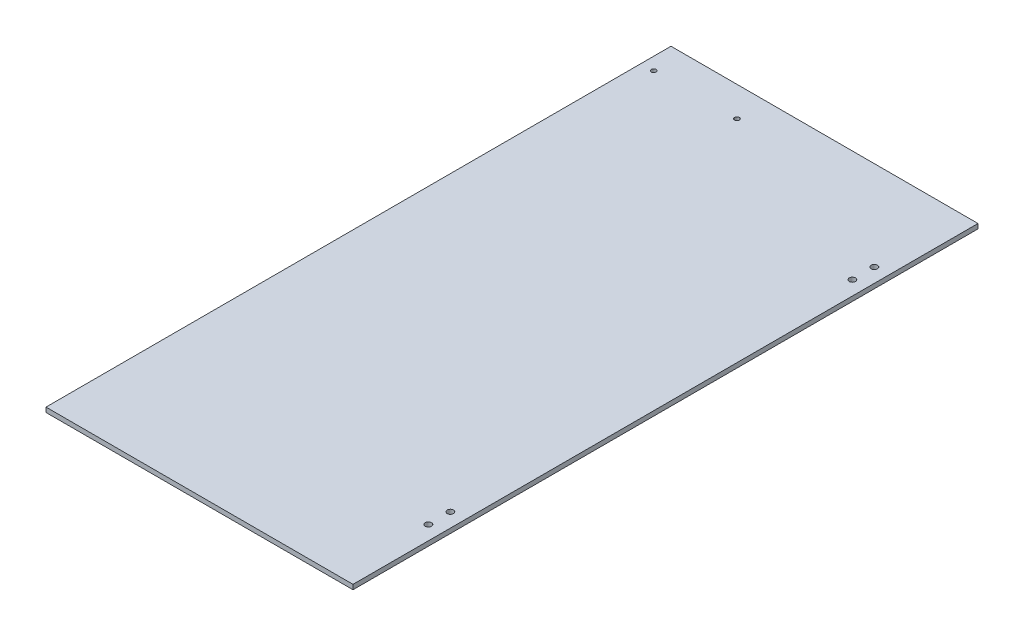
ISO-10303-21;
HEADER;
FILE_DESCRIPTION(('STEP AP214'),'2;1');
FILE_NAME('part.step','',(''),(''),'','','');
FILE_SCHEMA(('AUTOMOTIVE_DESIGN { 1 0 10303 214 1 1 1 1 }'));
ENDSEC;
DATA;
#1=APPLICATION_CONTEXT('core data for automotive mechanical design processes');
#2=APPLICATION_PROTOCOL_DEFINITION('international standard','automotive_design',2000,#1);
#3=PRODUCT_CONTEXT('',#1,'mechanical');
#4=PRODUCT('Part','Part','',(#3));
#5=PRODUCT_RELATED_PRODUCT_CATEGORY('part','',(#4));
#6=PRODUCT_DEFINITION_FORMATION('','',#4);
#7=PRODUCT_DEFINITION_CONTEXT('part definition',#1,'design');
#8=PRODUCT_DEFINITION('design','',#6,#7);
#9=PRODUCT_DEFINITION_SHAPE('','',#8);
#10=(LENGTH_UNIT() NAMED_UNIT(*) SI_UNIT(.MILLI.,.METRE.));
#11=(NAMED_UNIT(*) PLANE_ANGLE_UNIT() SI_UNIT($,.RADIAN.));
#12=(NAMED_UNIT(*) SI_UNIT($,.STERADIAN.) SOLID_ANGLE_UNIT());
#13=UNCERTAINTY_MEASURE_WITH_UNIT(LENGTH_MEASURE(1.E-05),#10,'distance_accuracy_value','');
#14=(GEOMETRIC_REPRESENTATION_CONTEXT(3) GLOBAL_UNCERTAINTY_ASSIGNED_CONTEXT((#13)) GLOBAL_UNIT_ASSIGNED_CONTEXT((#10,
#11,#12)) REPRESENTATION_CONTEXT('',''));
#15=CARTESIAN_POINT('',(0.,0.,0.));
#16=DIRECTION('',(0.,0.,1.));
#17=DIRECTION('',(1.,0.,0.));
#18=AXIS2_PLACEMENT_3D('',#15,#16,#17);
#19=CARTESIAN_POINT('',(0.,-193.798939869289,0.));
#20=DIRECTION('',(0.,1.,0.));
#21=DIRECTION('',(0.,0.,1.));
#22=AXIS2_PLACEMENT_3D('',#19,#20,#21);
#23=PLANE('',#22);
#24=CARTESIAN_POINT('',(99.7891563862978,-193.798939869289,731.620141884642));
#25=DIRECTION('',(0.,1.,0.));
#26=DIRECTION('',(0.,0.,1.));
#27=AXIS2_PLACEMENT_3D('',#24,#25,#26);
#28=CIRCLE('',#27,2.);
#29=CARTESIAN_POINT('',(99.7891563862978,-193.798939869289,733.620141884642));
#30=VERTEX_POINT('',#29);
#31=EDGE_CURVE('E113',#30,#30,#28,.T.);
#32=ORIENTED_EDGE('',*,*,#31,.F.);
#33=EDGE_LOOP('',(#32));
#34=FACE_BOUND('',#33,.T.);
#35=CARTESIAN_POINT('',(99.7891563862979,-193.798939869289,717.620141884642));
#36=DIRECTION('',(0.,1.,0.));
#37=DIRECTION('',(0.,0.,1.));
#38=AXIS2_PLACEMENT_3D('',#35,#36,#37);
#39=CIRCLE('',#38,2.);
#40=CARTESIAN_POINT('',(99.7891563862979,-193.798939869289,719.620141884642));
#41=VERTEX_POINT('',#40);
#42=EDGE_CURVE('E120',#41,#41,#39,.T.);
#43=ORIENTED_EDGE('',*,*,#42,.F.);
#44=EDGE_LOOP('',(#43));
#45=FACE_BOUND('',#44,.T.);
#46=CARTESIAN_POINT('',(99.7891563862979,-193.798939869289,461.620141884643));
#47=DIRECTION('',(0.,1.,0.));
#48=DIRECTION('',(0.,0.,1.));
#49=AXIS2_PLACEMENT_3D('',#46,#47,#48);
#50=CIRCLE('',#49,2.);
#51=CARTESIAN_POINT('',(99.7891563862979,-193.798939869289,463.620141884643));
#52=VERTEX_POINT('',#51);
#53=EDGE_CURVE('E124',#52,#52,#50,.T.);
#54=ORIENTED_EDGE('',*,*,#53,.F.);
#55=EDGE_LOOP('',(#54));
#56=FACE_BOUND('',#55,.T.);
#57=CARTESIAN_POINT('',(99.7891563862979,-193.798939869289,447.620141884643));
#58=DIRECTION('',(0.,1.,0.));
#59=DIRECTION('',(0.,0.,1.));
#60=AXIS2_PLACEMENT_3D('',#57,#58,#59);
#61=CIRCLE('',#60,2.);
#62=CARTESIAN_POINT('',(99.7891563862979,-193.798939869289,449.620141884643));
#63=VERTEX_POINT('',#62);
#64=EDGE_CURVE('E128',#63,#63,#61,.T.);
#65=ORIENTED_EDGE('',*,*,#64,.F.);
#66=EDGE_LOOP('',(#65));
#67=FACE_BOUND('',#66,.T.);
#68=CARTESIAN_POINT('',(-25.7108436137021,-193.798939869289,409.620141884643));
#69=DIRECTION('',(0.,1.,0.));
#70=DIRECTION('',(0.,0.,-1.));
#71=AXIS2_PLACEMENT_3D('',#68,#69,#70);
#72=CIRCLE('',#71,1.50000000000002);
#73=CARTESIAN_POINT('',(-25.7108436137021,-193.798939869289,408.120141884643));
#74=VERTEX_POINT('',#73);
#75=EDGE_CURVE('E108',#74,#74,#72,.T.);
#76=ORIENTED_EDGE('',*,*,#75,.F.);
#77=EDGE_LOOP('',(#76));
#78=FACE_BOUND('',#77,.T.);
#79=CARTESIAN_POINT('',(-78.7108436137022,-193.798939869289,409.620141884643));
#80=DIRECTION('',(0.,1.,0.));
#81=DIRECTION('',(0.,0.,-1.));
#82=AXIS2_PLACEMENT_3D('',#79,#80,#81);
#83=CIRCLE('',#82,1.50000000000002);
#84=CARTESIAN_POINT('',(-78.7108436137022,-193.798939869289,408.120141884643));
#85=VERTEX_POINT('',#84);
#86=EDGE_CURVE('E109',#85,#85,#83,.T.);
#87=ORIENTED_EDGE('',*,*,#86,.F.);
#88=EDGE_LOOP('',(#87));
#89=FACE_BOUND('',#88,.T.);
#90=DIRECTION('',(-1.,0.,0.));
#91=VECTOR('',#90,1.);
#92=CARTESIAN_POINT('',(0.,-193.798939869289,390.620141884643));
#93=LINE('',#92,#91);
#94=CARTESIAN_POINT('',(108.789156386298,-193.798939869289,390.620141884643));
#95=VERTEX_POINT('',#94);
#96=CARTESIAN_POINT('',(-86.7108436137022,-193.798939869289,390.620141884643));
#97=VERTEX_POINT('',#96);
#98=EDGE_CURVE('E77',#95,#97,#93,.T.);
#99=ORIENTED_EDGE('',*,*,#98,.T.);
#100=DIRECTION('',(0.,0.,1.));
#101=VECTOR('',#100,1.);
#102=CARTESIAN_POINT('',(-86.7108436137022,-193.798939869289,0.));
#103=LINE('',#102,#101);
#104=CARTESIAN_POINT('',(-86.7108436137022,-193.798939869289,788.620141884643));
#105=VERTEX_POINT('',#104);
#106=EDGE_CURVE('E56',#97,#105,#103,.T.);
#107=ORIENTED_EDGE('',*,*,#106,.T.);
#108=DIRECTION('',(1.,0.,0.));
#109=VECTOR('',#108,1.);
#110=CARTESIAN_POINT('',(0.,-193.798939869289,788.620141884643));
#111=LINE('',#110,#109);
#112=CARTESIAN_POINT('',(108.789156386298,-193.798939869289,788.620141884643));
#113=VERTEX_POINT('',#112);
#114=EDGE_CURVE('E137',#105,#113,#111,.T.);
#115=ORIENTED_EDGE('',*,*,#114,.T.);
#116=DIRECTION('',(0.,0.,1.));
#117=VECTOR('',#116,1.);
#118=CARTESIAN_POINT('',(108.789156386298,-193.798939869289,789.620141884642));
#119=LINE('',#118,#117);
#120=EDGE_CURVE('E153',#113,#95,#119,.F.);
#121=ORIENTED_EDGE('',*,*,#120,.T.);
#122=EDGE_LOOP('',(#99,#107,#115,#121));
#123=FACE_BOUND('',#122,.T.);
#124=ADVANCED_FACE('F40',(#34,#45,#56,#67,#78,#89,#123),#23,.T.);
#125=CARTESIAN_POINT('',(0.,-196.798939869289,0.));
#126=DIRECTION('',(0.,1.,0.));
#127=DIRECTION('',(0.,0.,1.));
#128=AXIS2_PLACEMENT_3D('',#125,#126,#127);
#129=PLANE('',#128);
#130=CARTESIAN_POINT('',(-78.7108436137022,-196.798939869289,409.620141884643));
#131=DIRECTION('',(0.,1.,0.));
#132=DIRECTION('',(0.,0.,1.));
#133=AXIS2_PLACEMENT_3D('',#130,#131,#132);
#134=CIRCLE('',#133,1.50000000000002);
#135=CARTESIAN_POINT('',(-78.7108436137022,-196.798939869289,411.120141884643));
#136=VERTEX_POINT('',#135);
#137=EDGE_CURVE('E104',#136,#136,#134,.T.);
#138=ORIENTED_EDGE('',*,*,#137,.T.);
#139=EDGE_LOOP('',(#138));
#140=FACE_BOUND('',#139,.T.);
#141=CARTESIAN_POINT('',(-25.7108436137021,-196.798939869289,409.620141884643));
#142=DIRECTION('',(0.,1.,0.));
#143=DIRECTION('',(0.,0.,1.));
#144=AXIS2_PLACEMENT_3D('',#141,#142,#143);
#145=CIRCLE('',#144,1.50000000000002);
#146=CARTESIAN_POINT('',(-25.7108436137021,-196.798939869289,411.120141884643));
#147=VERTEX_POINT('',#146);
#148=EDGE_CURVE('E98',#147,#147,#145,.T.);
#149=ORIENTED_EDGE('',*,*,#148,.T.);
#150=EDGE_LOOP('',(#149));
#151=FACE_BOUND('',#150,.T.);
#152=CARTESIAN_POINT('',(99.7891563862979,-196.798939869289,447.620141884643));
#153=DIRECTION('',(0.,-1.,0.));
#154=DIRECTION('',(0.,0.,1.));
#155=AXIS2_PLACEMENT_3D('',#152,#153,#154);
#156=CIRCLE('',#155,2.);
#157=CARTESIAN_POINT('',(99.7891563862979,-196.798939869289,449.620141884643));
#158=VERTEX_POINT('',#157);
#159=EDGE_CURVE('E132',#158,#158,#156,.T.);
#160=ORIENTED_EDGE('',*,*,#159,.F.);
#161=EDGE_LOOP('',(#160));
#162=FACE_BOUND('',#161,.T.);
#163=CARTESIAN_POINT('',(99.7891563862979,-196.798939869289,461.620141884643));
#164=DIRECTION('',(0.,-1.,0.));
#165=DIRECTION('',(0.,0.,1.));
#166=AXIS2_PLACEMENT_3D('',#163,#164,#165);
#167=CIRCLE('',#166,2.);
#168=CARTESIAN_POINT('',(99.7891563862979,-196.798939869289,463.620141884643));
#169=VERTEX_POINT('',#168);
#170=EDGE_CURVE('E136',#169,#169,#167,.T.);
#171=ORIENTED_EDGE('',*,*,#170,.F.);
#172=EDGE_LOOP('',(#171));
#173=FACE_BOUND('',#172,.T.);
#174=CARTESIAN_POINT('',(99.7891563862979,-196.798939869289,717.620141884642));
#175=DIRECTION('',(0.,-1.,0.));
#176=DIRECTION('',(0.,0.,-1.));
#177=AXIS2_PLACEMENT_3D('',#174,#175,#176);
#178=CIRCLE('',#177,2.);
#179=CARTESIAN_POINT('',(99.7891563862979,-196.798939869289,715.620141884642));
#180=VERTEX_POINT('',#179);
#181=EDGE_CURVE('E141',#180,#180,#178,.T.);
#182=ORIENTED_EDGE('',*,*,#181,.F.);
#183=EDGE_LOOP('',(#182));
#184=FACE_BOUND('',#183,.T.);
#185=CARTESIAN_POINT('',(99.7891563862978,-196.798939869289,731.620141884642));
#186=DIRECTION('',(0.,-1.,0.));
#187=DIRECTION('',(0.,0.,-1.));
#188=AXIS2_PLACEMENT_3D('',#185,#186,#187);
#189=CIRCLE('',#188,2.);
#190=CARTESIAN_POINT('',(99.7891563862978,-196.798939869289,729.620141884642));
#191=VERTEX_POINT('',#190);
#192=EDGE_CURVE('E131',#191,#191,#189,.T.);
#193=ORIENTED_EDGE('',*,*,#192,.F.);
#194=EDGE_LOOP('',(#193));
#195=FACE_BOUND('',#194,.T.);
#196=DIRECTION('',(0.,0.,1.));
#197=VECTOR('',#196,1.);
#198=CARTESIAN_POINT('',(-86.7108436137022,-196.798939869289,0.));
#199=LINE('',#198,#197);
#200=CARTESIAN_POINT('',(-86.7108436137022,-196.798939869289,390.620141884643));
#201=VERTEX_POINT('',#200);
#202=CARTESIAN_POINT('',(-86.7108436137022,-196.798939869289,788.620141884643));
#203=VERTEX_POINT('',#202);
#204=EDGE_CURVE('E84',#201,#203,#199,.T.);
#205=ORIENTED_EDGE('',*,*,#204,.F.);
#206=DIRECTION('',(-1.,0.,0.));
#207=VECTOR('',#206,1.);
#208=CARTESIAN_POINT('',(0.,-196.798939869289,390.620141884643));
#209=LINE('',#208,#207);
#210=CARTESIAN_POINT('',(108.789156386298,-196.798939869289,390.620141884643));
#211=VERTEX_POINT('',#210);
#212=EDGE_CURVE('E49',#211,#201,#209,.T.);
#213=ORIENTED_EDGE('',*,*,#212,.F.);
#214=DIRECTION('',(0.,0.,1.));
#215=VECTOR('',#214,1.);
#216=CARTESIAN_POINT('',(108.789156386298,-196.798939869289,789.620141884642));
#217=LINE('',#216,#215);
#218=CARTESIAN_POINT('',(108.789156386298,-196.798939869289,788.620141884643));
#219=VERTEX_POINT('',#218);
#220=EDGE_CURVE('E152',#219,#211,#217,.F.);
#221=ORIENTED_EDGE('',*,*,#220,.F.);
#222=DIRECTION('',(1.,0.,0.));
#223=VECTOR('',#222,1.);
#224=CARTESIAN_POINT('',(0.,-196.798939869289,788.620141884643));
#225=LINE('',#224,#223);
#226=EDGE_CURVE('E88',#203,#219,#225,.T.);
#227=ORIENTED_EDGE('',*,*,#226,.F.);
#228=EDGE_LOOP('',(#205,#213,#221,#227));
#229=FACE_BOUND('',#228,.T.);
#230=ADVANCED_FACE('F42',(#140,#151,#162,#173,#184,#195,#229),#129,.F.);
#231=CARTESIAN_POINT('',(0.,0.,788.620141884643));
#232=DIRECTION('',(0.,0.,1.));
#233=DIRECTION('',(1.,0.,0.));
#234=AXIS2_PLACEMENT_3D('',#231,#232,#233);
#235=PLANE('',#234);
#236=ORIENTED_EDGE('',*,*,#114,.F.);
#237=DIRECTION('',(0.,-1.,0.));
#238=VECTOR('',#237,1.);
#239=CARTESIAN_POINT('',(-86.7108436137022,0.,788.620141884643));
#240=LINE('',#239,#238);
#241=EDGE_CURVE('E82',#105,#203,#240,.T.);
#242=ORIENTED_EDGE('',*,*,#241,.T.);
#243=ORIENTED_EDGE('',*,*,#226,.T.);
#244=DIRECTION('',(0.,1.,0.));
#245=VECTOR('',#244,1.);
#246=CARTESIAN_POINT('',(108.789156386298,-193.798939869289,788.620141884643));
#247=LINE('',#246,#245);
#248=EDGE_CURVE('E157',#219,#113,#247,.T.);
#249=ORIENTED_EDGE('',*,*,#248,.T.);
#250=EDGE_LOOP('',(#236,#242,#243,#249));
#251=FACE_BOUND('',#250,.T.);
#252=ADVANCED_FACE('F171',(#251),#235,.T.);
#253=CARTESIAN_POINT('',(0.,0.,390.620141884643));
#254=DIRECTION('',(0.,0.,-1.));
#255=DIRECTION('',(-1.,0.,0.));
#256=AXIS2_PLACEMENT_3D('',#253,#254,#255);
#257=PLANE('',#256);
#258=ORIENTED_EDGE('',*,*,#212,.T.);
#259=DIRECTION('',(0.,1.,0.));
#260=VECTOR('',#259,1.);
#261=CARTESIAN_POINT('',(-86.7108436137022,0.,390.620141884643));
#262=LINE('',#261,#260);
#263=EDGE_CURVE('E11',#201,#97,#262,.T.);
#264=ORIENTED_EDGE('',*,*,#263,.T.);
#265=ORIENTED_EDGE('',*,*,#98,.F.);
#266=DIRECTION('',(0.,1.,0.));
#267=VECTOR('',#266,1.);
#268=CARTESIAN_POINT('',(108.789156386298,-193.798939869289,390.620141884643));
#269=LINE('',#268,#267);
#270=EDGE_CURVE('E92',#95,#211,#269,.F.);
#271=ORIENTED_EDGE('',*,*,#270,.T.);
#272=EDGE_LOOP('',(#258,#264,#265,#271));
#273=FACE_BOUND('',#272,.T.);
#274=ADVANCED_FACE('F91',(#273),#257,.T.);
#275=CARTESIAN_POINT('',(-78.7108436137022,-203.798939869289,409.620141884643));
#276=DIRECTION('',(0.,1.,0.));
#277=DIRECTION('',(0.,0.,1.));
#278=AXIS2_PLACEMENT_3D('',#275,#276,#277);
#279=CYLINDRICAL_SURFACE('',#278,1.50000000000002);
#280=ORIENTED_EDGE('',*,*,#86,.T.);
#281=EDGE_LOOP('',(#280));
#282=FACE_BOUND('',#281,.T.);
#283=ORIENTED_EDGE('',*,*,#137,.F.);
#284=EDGE_LOOP('',(#283));
#285=FACE_BOUND('',#284,.T.);
#286=ADVANCED_FACE('F196',(#282,#285),#279,.F.);
#287=CARTESIAN_POINT('',(-25.7108436137021,-203.798939869289,409.620141884643));
#288=DIRECTION('',(0.,1.,0.));
#289=DIRECTION('',(0.,0.,1.));
#290=AXIS2_PLACEMENT_3D('',#287,#288,#289);
#291=CYLINDRICAL_SURFACE('',#290,1.50000000000002);
#292=ORIENTED_EDGE('',*,*,#75,.T.);
#293=EDGE_LOOP('',(#292));
#294=FACE_BOUND('',#293,.T.);
#295=ORIENTED_EDGE('',*,*,#148,.F.);
#296=EDGE_LOOP('',(#295));
#297=FACE_BOUND('',#296,.T.);
#298=ADVANCED_FACE('F199',(#294,#297),#291,.F.);
#299=CARTESIAN_POINT('',(99.7891563862979,-186.798939869289,447.620141884643));
#300=DIRECTION('',(0.,-1.,0.));
#301=DIRECTION('',(0.,0.,-1.));
#302=AXIS2_PLACEMENT_3D('',#299,#300,#301);
#303=CYLINDRICAL_SURFACE('',#302,2.);
#304=ORIENTED_EDGE('',*,*,#64,.T.);
#305=EDGE_LOOP('',(#304));
#306=FACE_BOUND('',#305,.T.);
#307=ORIENTED_EDGE('',*,*,#159,.T.);
#308=EDGE_LOOP('',(#307));
#309=FACE_BOUND('',#308,.T.);
#310=ADVANCED_FACE('F203',(#306,#309),#303,.F.);
#311=CARTESIAN_POINT('',(99.7891563862979,-186.798939869289,461.620141884643));
#312=DIRECTION('',(0.,-1.,0.));
#313=DIRECTION('',(0.,0.,-1.));
#314=AXIS2_PLACEMENT_3D('',#311,#312,#313);
#315=CYLINDRICAL_SURFACE('',#314,2.);
#316=ORIENTED_EDGE('',*,*,#53,.T.);
#317=EDGE_LOOP('',(#316));
#318=FACE_BOUND('',#317,.T.);
#319=ORIENTED_EDGE('',*,*,#170,.T.);
#320=EDGE_LOOP('',(#319));
#321=FACE_BOUND('',#320,.T.);
#322=ADVANCED_FACE('F207',(#318,#321),#315,.F.);
#323=CARTESIAN_POINT('',(99.7891563862979,-186.798939869289,717.620141884642));
#324=DIRECTION('',(0.,-1.,0.));
#325=DIRECTION('',(0.,0.,-1.));
#326=AXIS2_PLACEMENT_3D('',#323,#324,#325);
#327=CYLINDRICAL_SURFACE('',#326,2.);
#328=ORIENTED_EDGE('',*,*,#42,.T.);
#329=EDGE_LOOP('',(#328));
#330=FACE_BOUND('',#329,.T.);
#331=ORIENTED_EDGE('',*,*,#181,.T.);
#332=EDGE_LOOP('',(#331));
#333=FACE_BOUND('',#332,.T.);
#334=ADVANCED_FACE('F183',(#330,#333),#327,.F.);
#335=CARTESIAN_POINT('',(99.7891563862978,-186.798939869289,731.620141884642));
#336=DIRECTION('',(0.,-1.,0.));
#337=DIRECTION('',(0.,0.,-1.));
#338=AXIS2_PLACEMENT_3D('',#335,#336,#337);
#339=CYLINDRICAL_SURFACE('',#338,2.);
#340=ORIENTED_EDGE('',*,*,#31,.T.);
#341=EDGE_LOOP('',(#340));
#342=FACE_BOUND('',#341,.T.);
#343=ORIENTED_EDGE('',*,*,#192,.T.);
#344=EDGE_LOOP('',(#343));
#345=FACE_BOUND('',#344,.T.);
#346=ADVANCED_FACE('F176',(#342,#345),#339,.F.);
#347=CARTESIAN_POINT('',(108.789156386298,-193.798939869289,789.620141884642));
#348=DIRECTION('',(-1.,0.,0.));
#349=DIRECTION('',(0.,0.,1.));
#350=AXIS2_PLACEMENT_3D('',#347,#348,#349);
#351=PLANE('',#350);
#352=ORIENTED_EDGE('',*,*,#270,.F.);
#353=ORIENTED_EDGE('',*,*,#120,.F.);
#354=ORIENTED_EDGE('',*,*,#248,.F.);
#355=ORIENTED_EDGE('',*,*,#220,.T.);
#356=EDGE_LOOP('',(#352,#353,#354,#355));
#357=FACE_BOUND('',#356,.T.);
#358=ADVANCED_FACE('F174',(#357),#351,.F.);
#359=CARTESIAN_POINT('',(-86.7108436137022,0.,0.));
#360=DIRECTION('',(-1.,0.,0.));
#361=DIRECTION('',(0.,0.,1.));
#362=AXIS2_PLACEMENT_3D('',#359,#360,#361);
#363=PLANE('',#362);
#364=ORIENTED_EDGE('',*,*,#106,.F.);
#365=ORIENTED_EDGE('',*,*,#263,.F.);
#366=ORIENTED_EDGE('',*,*,#204,.T.);
#367=ORIENTED_EDGE('',*,*,#241,.F.);
#368=EDGE_LOOP('',(#364,#365,#366,#367));
#369=FACE_BOUND('',#368,.T.);
#370=ADVANCED_FACE('F86',(#369),#363,.T.);
#371=CLOSED_SHELL('',(#124,#230,#252,#274,#286,#298,#310,#322,#334,#346,#358,#370));
#372=MANIFOLD_SOLID_BREP('B2',#371);
#373=ADVANCED_BREP_SHAPE_REPRESENTATION('',(#18,#372),#14);
#374=SHAPE_DEFINITION_REPRESENTATION(#9,#373);
ENDSEC;
END-ISO-10303-21;
